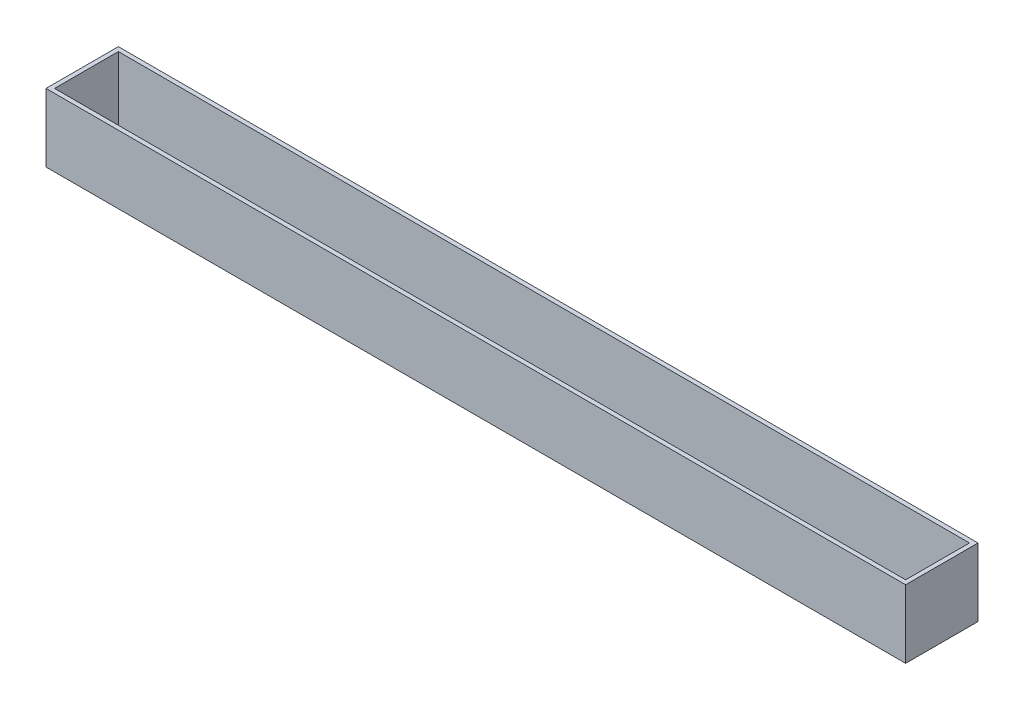
ISO-10303-21;
HEADER;
FILE_DESCRIPTION(('STEP AP214'),'2;1');
FILE_NAME('part.step','',(''),(''),'','','');
FILE_SCHEMA(('AUTOMOTIVE_DESIGN { 1 0 10303 214 1 1 1 1 }'));
ENDSEC;
DATA;
#1=APPLICATION_CONTEXT('core data for automotive mechanical design processes');
#2=APPLICATION_PROTOCOL_DEFINITION('international standard','automotive_design',2000,#1);
#3=PRODUCT_CONTEXT('',#1,'mechanical');
#4=PRODUCT('Part','Part','',(#3));
#5=PRODUCT_RELATED_PRODUCT_CATEGORY('part','',(#4));
#6=PRODUCT_DEFINITION_FORMATION('','',#4);
#7=PRODUCT_DEFINITION_CONTEXT('part definition',#1,'design');
#8=PRODUCT_DEFINITION('design','',#6,#7);
#9=PRODUCT_DEFINITION_SHAPE('','',#8);
#10=(LENGTH_UNIT() NAMED_UNIT(*) SI_UNIT(.MILLI.,.METRE.));
#11=(NAMED_UNIT(*) PLANE_ANGLE_UNIT() SI_UNIT($,.RADIAN.));
#12=(NAMED_UNIT(*) SI_UNIT($,.STERADIAN.) SOLID_ANGLE_UNIT());
#13=UNCERTAINTY_MEASURE_WITH_UNIT(LENGTH_MEASURE(1.E-05),#10,'distance_accuracy_value','');
#14=(GEOMETRIC_REPRESENTATION_CONTEXT(3) GLOBAL_UNCERTAINTY_ASSIGNED_CONTEXT((#13)) GLOBAL_UNIT_ASSIGNED_CONTEXT((#10,
#11,#12)) REPRESENTATION_CONTEXT('',''));
#15=CARTESIAN_POINT('',(0.,0.,0.));
#16=DIRECTION('',(0.,0.,1.));
#17=DIRECTION('',(1.,0.,0.));
#18=AXIS2_PLACEMENT_3D('',#15,#16,#17);
#19=CARTESIAN_POINT('',(-62.8042220957826,32.,-34.));
#20=DIRECTION('',(1.,0.,0.));
#21=DIRECTION('',(0.,0.,-1.));
#22=AXIS2_PLACEMENT_3D('',#19,#20,#21);
#23=PLANE('',#22);
#24=DIRECTION('',(0.,0.,1.));
#25=VECTOR('',#24,1.);
#26=CARTESIAN_POINT('',(-62.8042220957826,0.,-34.));
#27=LINE('',#26,#25);
#28=CARTESIAN_POINT('',(-62.8042220957826,0.,-34.));
#29=VERTEX_POINT('',#28);
#30=CARTESIAN_POINT('',(-62.8042220957826,0.,0.));
#31=VERTEX_POINT('',#30);
#32=EDGE_CURVE('E140',#29,#31,#27,.T.);
#33=ORIENTED_EDGE('',*,*,#32,.T.);
#34=DIRECTION('',(0.,-1.,0.));
#35=VECTOR('',#34,1.);
#36=CARTESIAN_POINT('',(-62.8042220957826,32.,0.));
#37=LINE('',#36,#35);
#38=CARTESIAN_POINT('',(-62.8042220957826,32.,0.));
#39=VERTEX_POINT('',#38);
#40=EDGE_CURVE('E11',#39,#31,#37,.T.);
#41=ORIENTED_EDGE('',*,*,#40,.F.);
#42=DIRECTION('',(0.,0.,1.));
#43=VECTOR('',#42,1.);
#44=CARTESIAN_POINT('',(-62.8042220957826,32.,-34.));
#45=LINE('',#44,#43);
#46=CARTESIAN_POINT('',(-62.8042220957826,32.,-34.));
#47=VERTEX_POINT('',#46);
#48=EDGE_CURVE('E144',#47,#39,#45,.T.);
#49=ORIENTED_EDGE('',*,*,#48,.F.);
#50=DIRECTION('',(0.,-1.,0.));
#51=VECTOR('',#50,1.);
#52=CARTESIAN_POINT('',(-62.8042220957826,32.,-34.));
#53=LINE('',#52,#51);
#54=EDGE_CURVE('E150',#47,#29,#53,.T.);
#55=ORIENTED_EDGE('',*,*,#54,.T.);
#56=EDGE_LOOP('',(#33,#41,#49,#55));
#57=FACE_BOUND('',#56,.T.);
#58=ADVANCED_FACE('F32',(#57),#23,.F.);
#59=CARTESIAN_POINT('',(-62.8042220957826,32.,0.));
#60=DIRECTION('',(0.,0.,-1.));
#61=DIRECTION('',(-1.,0.,0.));
#62=AXIS2_PLACEMENT_3D('',#59,#60,#61);
#63=PLANE('',#62);
#64=DIRECTION('',(1.,0.,0.));
#65=VECTOR('',#64,1.);
#66=CARTESIAN_POINT('',(-62.8042220957826,0.,0.));
#67=LINE('',#66,#65);
#68=CARTESIAN_POINT('',(341.195777904217,0.,0.));
#69=VERTEX_POINT('',#68);
#70=EDGE_CURVE('E153',#31,#69,#67,.T.);
#71=ORIENTED_EDGE('',*,*,#70,.T.);
#72=DIRECTION('',(0.,-1.,0.));
#73=VECTOR('',#72,1.);
#74=CARTESIAN_POINT('',(341.195777904217,32.,0.));
#75=LINE('',#74,#73);
#76=CARTESIAN_POINT('',(341.195777904217,32.,0.));
#77=VERTEX_POINT('',#76);
#78=EDGE_CURVE('E39',#77,#69,#75,.T.);
#79=ORIENTED_EDGE('',*,*,#78,.F.);
#80=DIRECTION('',(1.,0.,0.));
#81=VECTOR('',#80,1.);
#82=CARTESIAN_POINT('',(-62.8042220957826,32.,0.));
#83=LINE('',#82,#81);
#84=EDGE_CURVE('E83',#39,#77,#83,.T.);
#85=ORIENTED_EDGE('',*,*,#84,.F.);
#86=ORIENTED_EDGE('',*,*,#40,.T.);
#87=EDGE_LOOP('',(#71,#79,#85,#86));
#88=FACE_BOUND('',#87,.T.);
#89=ADVANCED_FACE('F182',(#88),#63,.F.);
#90=CARTESIAN_POINT('',(341.195777904217,32.,-34.));
#91=DIRECTION('',(-1.,0.,0.));
#92=DIRECTION('',(0.,0.,1.));
#93=AXIS2_PLACEMENT_3D('',#90,#91,#92);
#94=PLANE('',#93);
#95=DIRECTION('',(0.,0.,-1.));
#96=VECTOR('',#95,1.);
#97=CARTESIAN_POINT('',(341.195777904217,0.,-34.));
#98=LINE('',#97,#96);
#99=CARTESIAN_POINT('',(341.195777904217,0.,-34.));
#100=VERTEX_POINT('',#99);
#101=EDGE_CURVE('E155',#69,#100,#98,.T.);
#102=ORIENTED_EDGE('',*,*,#101,.T.);
#103=DIRECTION('',(0.,-1.,0.));
#104=VECTOR('',#103,1.);
#105=CARTESIAN_POINT('',(341.195777904217,32.,-34.));
#106=LINE('',#105,#104);
#107=CARTESIAN_POINT('',(341.195777904217,32.,-34.));
#108=VERTEX_POINT('',#107);
#109=EDGE_CURVE('E159',#108,#100,#106,.T.);
#110=ORIENTED_EDGE('',*,*,#109,.F.);
#111=DIRECTION('',(0.,0.,-1.));
#112=VECTOR('',#111,1.);
#113=CARTESIAN_POINT('',(341.195777904217,32.,-34.));
#114=LINE('',#113,#112);
#115=EDGE_CURVE('E147',#77,#108,#114,.T.);
#116=ORIENTED_EDGE('',*,*,#115,.F.);
#117=ORIENTED_EDGE('',*,*,#78,.T.);
#118=EDGE_LOOP('',(#102,#110,#116,#117));
#119=FACE_BOUND('',#118,.T.);
#120=ADVANCED_FACE('F164',(#119),#94,.F.);
#121=CARTESIAN_POINT('',(-62.8042220957826,32.,-34.));
#122=DIRECTION('',(0.,0.,1.));
#123=DIRECTION('',(1.,0.,0.));
#124=AXIS2_PLACEMENT_3D('',#121,#122,#123);
#125=PLANE('',#124);
#126=DIRECTION('',(-1.,0.,0.));
#127=VECTOR('',#126,1.);
#128=CARTESIAN_POINT('',(-62.8042220957826,0.,-34.));
#129=LINE('',#128,#127);
#130=EDGE_CURVE('E76',#100,#29,#129,.T.);
#131=ORIENTED_EDGE('',*,*,#130,.T.);
#132=ORIENTED_EDGE('',*,*,#54,.F.);
#133=DIRECTION('',(-1.,0.,0.));
#134=VECTOR('',#133,1.);
#135=CARTESIAN_POINT('',(-62.8042220957826,32.,-34.));
#136=LINE('',#135,#134);
#137=EDGE_CURVE('E55',#108,#47,#136,.T.);
#138=ORIENTED_EDGE('',*,*,#137,.F.);
#139=ORIENTED_EDGE('',*,*,#109,.T.);
#140=EDGE_LOOP('',(#131,#132,#138,#139));
#141=FACE_BOUND('',#140,.T.);
#142=ADVANCED_FACE('F172',(#141),#125,.F.);
#143=CARTESIAN_POINT('',(0.,32.,0.));
#144=DIRECTION('',(0.,1.,0.));
#145=DIRECTION('',(0.,0.,1.));
#146=AXIS2_PLACEMENT_3D('',#143,#144,#145);
#147=PLANE('',#146);
#148=DIRECTION('',(0.,0.,-1.));
#149=VECTOR('',#148,1.);
#150=CARTESIAN_POINT('',(339.195777904217,32.,-32.));
#151=LINE('',#150,#149);
#152=CARTESIAN_POINT('',(339.195777904217,32.,-2.));
#153=VERTEX_POINT('',#152);
#154=CARTESIAN_POINT('',(339.195777904217,32.,-32.));
#155=VERTEX_POINT('',#154);
#156=EDGE_CURVE('E46',#153,#155,#151,.T.);
#157=ORIENTED_EDGE('',*,*,#156,.F.);
#158=DIRECTION('',(1.,0.,0.));
#159=VECTOR('',#158,1.);
#160=CARTESIAN_POINT('',(-60.8042220957826,32.,-2.));
#161=LINE('',#160,#159);
#162=CARTESIAN_POINT('',(-60.8042220957826,32.,-2.));
#163=VERTEX_POINT('',#162);
#164=EDGE_CURVE('E125',#163,#153,#161,.T.);
#165=ORIENTED_EDGE('',*,*,#164,.F.);
#166=DIRECTION('',(0.,0.,1.));
#167=VECTOR('',#166,1.);
#168=CARTESIAN_POINT('',(-60.8042220957826,32.,-32.));
#169=LINE('',#168,#167);
#170=CARTESIAN_POINT('',(-60.8042220957826,32.,-32.));
#171=VERTEX_POINT('',#170);
#172=EDGE_CURVE('E128',#171,#163,#169,.T.);
#173=ORIENTED_EDGE('',*,*,#172,.F.);
#174=DIRECTION('',(-1.,0.,0.));
#175=VECTOR('',#174,1.);
#176=CARTESIAN_POINT('',(-60.8042220957826,32.,-32.));
#177=LINE('',#176,#175);
#178=EDGE_CURVE('E134',#155,#171,#177,.T.);
#179=ORIENTED_EDGE('',*,*,#178,.F.);
#180=EDGE_LOOP('',(#157,#165,#173,#179));
#181=FACE_BOUND('',#180,.T.);
#182=ORIENTED_EDGE('',*,*,#48,.T.);
#183=ORIENTED_EDGE('',*,*,#84,.T.);
#184=ORIENTED_EDGE('',*,*,#115,.T.);
#185=ORIENTED_EDGE('',*,*,#137,.T.);
#186=EDGE_LOOP('',(#182,#183,#184,#185));
#187=FACE_BOUND('',#186,.T.);
#188=ADVANCED_FACE('F174',(#181,#187),#147,.T.);
#189=CARTESIAN_POINT('',(0.,0.,0.));
#190=DIRECTION('',(0.,1.,0.));
#191=DIRECTION('',(0.,0.,1.));
#192=AXIS2_PLACEMENT_3D('',#189,#190,#191);
#193=PLANE('',#192);
#194=ORIENTED_EDGE('',*,*,#32,.F.);
#195=ORIENTED_EDGE('',*,*,#130,.F.);
#196=ORIENTED_EDGE('',*,*,#101,.F.);
#197=ORIENTED_EDGE('',*,*,#70,.F.);
#198=EDGE_LOOP('',(#194,#195,#196,#197));
#199=FACE_BOUND('',#198,.T.);
#200=ADVANCED_FACE('F168',(#199),#193,.F.);
#201=CARTESIAN_POINT('',(339.195777904217,2.,-32.));
#202=DIRECTION('',(1.,0.,0.));
#203=DIRECTION('',(0.,0.,-1.));
#204=AXIS2_PLACEMENT_3D('',#201,#202,#203);
#205=PLANE('',#204);
#206=ORIENTED_EDGE('',*,*,#156,.T.);
#207=DIRECTION('',(0.,1.,0.));
#208=VECTOR('',#207,1.);
#209=CARTESIAN_POINT('',(339.195777904217,2.,-32.));
#210=LINE('',#209,#208);
#211=CARTESIAN_POINT('',(339.195777904217,2.,-32.));
#212=VERTEX_POINT('',#211);
#213=EDGE_CURVE('E103',#212,#155,#210,.T.);
#214=ORIENTED_EDGE('',*,*,#213,.F.);
#215=DIRECTION('',(0.,0.,-1.));
#216=VECTOR('',#215,1.);
#217=CARTESIAN_POINT('',(339.195777904217,2.,-32.));
#218=LINE('',#217,#216);
#219=CARTESIAN_POINT('',(339.195777904217,2.,-2.));
#220=VERTEX_POINT('',#219);
#221=EDGE_CURVE('E107',#220,#212,#218,.T.);
#222=ORIENTED_EDGE('',*,*,#221,.F.);
#223=DIRECTION('',(0.,1.,0.));
#224=VECTOR('',#223,1.);
#225=CARTESIAN_POINT('',(339.195777904217,2.,-2.));
#226=LINE('',#225,#224);
#227=EDGE_CURVE('E138',#220,#153,#226,.T.);
#228=ORIENTED_EDGE('',*,*,#227,.T.);
#229=EDGE_LOOP('',(#206,#214,#222,#228));
#230=FACE_BOUND('',#229,.T.);
#231=ADVANCED_FACE('F105',(#230),#205,.F.);
#232=CARTESIAN_POINT('',(-60.8042220957826,2.,-2.));
#233=DIRECTION('',(0.,0.,1.));
#234=DIRECTION('',(1.,0.,0.));
#235=AXIS2_PLACEMENT_3D('',#232,#233,#234);
#236=PLANE('',#235);
#237=ORIENTED_EDGE('',*,*,#164,.T.);
#238=ORIENTED_EDGE('',*,*,#227,.F.);
#239=DIRECTION('',(1.,0.,0.));
#240=VECTOR('',#239,1.);
#241=CARTESIAN_POINT('',(-60.8042220957826,2.,-2.));
#242=LINE('',#241,#240);
#243=CARTESIAN_POINT('',(-60.8042220957826,2.,-2.));
#244=VERTEX_POINT('',#243);
#245=EDGE_CURVE('E113',#244,#220,#242,.T.);
#246=ORIENTED_EDGE('',*,*,#245,.F.);
#247=DIRECTION('',(0.,1.,0.));
#248=VECTOR('',#247,1.);
#249=CARTESIAN_POINT('',(-60.8042220957826,2.,-2.));
#250=LINE('',#249,#248);
#251=EDGE_CURVE('E141',#244,#163,#250,.T.);
#252=ORIENTED_EDGE('',*,*,#251,.T.);
#253=EDGE_LOOP('',(#237,#238,#246,#252));
#254=FACE_BOUND('',#253,.T.);
#255=ADVANCED_FACE('F221',(#254),#236,.F.);
#256=CARTESIAN_POINT('',(-60.8042220957826,2.,-32.));
#257=DIRECTION('',(-1.,0.,0.));
#258=DIRECTION('',(0.,0.,1.));
#259=AXIS2_PLACEMENT_3D('',#256,#257,#258);
#260=PLANE('',#259);
#261=ORIENTED_EDGE('',*,*,#172,.T.);
#262=ORIENTED_EDGE('',*,*,#251,.F.);
#263=DIRECTION('',(0.,0.,1.));
#264=VECTOR('',#263,1.);
#265=CARTESIAN_POINT('',(-60.8042220957826,2.,-32.));
#266=LINE('',#265,#264);
#267=CARTESIAN_POINT('',(-60.8042220957826,2.,-32.));
#268=VERTEX_POINT('',#267);
#269=EDGE_CURVE('E121',#268,#244,#266,.T.);
#270=ORIENTED_EDGE('',*,*,#269,.F.);
#271=DIRECTION('',(0.,1.,0.));
#272=VECTOR('',#271,1.);
#273=CARTESIAN_POINT('',(-60.8042220957826,2.,-32.));
#274=LINE('',#273,#272);
#275=EDGE_CURVE('E112',#268,#171,#274,.T.);
#276=ORIENTED_EDGE('',*,*,#275,.T.);
#277=EDGE_LOOP('',(#261,#262,#270,#276));
#278=FACE_BOUND('',#277,.T.);
#279=ADVANCED_FACE('F230',(#278),#260,.F.);
#280=CARTESIAN_POINT('',(-60.8042220957826,2.,-32.));
#281=DIRECTION('',(0.,0.,-1.));
#282=DIRECTION('',(-1.,0.,0.));
#283=AXIS2_PLACEMENT_3D('',#280,#281,#282);
#284=PLANE('',#283);
#285=ORIENTED_EDGE('',*,*,#178,.T.);
#286=ORIENTED_EDGE('',*,*,#275,.F.);
#287=DIRECTION('',(-1.,0.,0.));
#288=VECTOR('',#287,1.);
#289=CARTESIAN_POINT('',(-60.8042220957826,2.,-32.));
#290=LINE('',#289,#288);
#291=EDGE_CURVE('E116',#212,#268,#290,.T.);
#292=ORIENTED_EDGE('',*,*,#291,.F.);
#293=ORIENTED_EDGE('',*,*,#213,.T.);
#294=EDGE_LOOP('',(#285,#286,#292,#293));
#295=FACE_BOUND('',#294,.T.);
#296=ADVANCED_FACE('F117',(#295),#284,.F.);
#297=CARTESIAN_POINT('',(0.,2.,0.));
#298=DIRECTION('',(0.,1.,0.));
#299=DIRECTION('',(0.,0.,1.));
#300=AXIS2_PLACEMENT_3D('',#297,#298,#299);
#301=PLANE('',#300);
#302=ORIENTED_EDGE('',*,*,#221,.T.);
#303=ORIENTED_EDGE('',*,*,#291,.T.);
#304=ORIENTED_EDGE('',*,*,#269,.T.);
#305=ORIENTED_EDGE('',*,*,#245,.T.);
#306=EDGE_LOOP('',(#302,#303,#304,#305));
#307=FACE_BOUND('',#306,.T.);
#308=ADVANCED_FACE('F123',(#307),#301,.T.);
#309=CLOSED_SHELL('',(#58,#89,#120,#142,#188,#200,#231,#255,#279,#296,#308));
#310=MANIFOLD_SOLID_BREP('B2',#309);
#311=ADVANCED_BREP_SHAPE_REPRESENTATION('',(#18,#310),#14);
#312=SHAPE_DEFINITION_REPRESENTATION(#9,#311);
ENDSEC;
END-ISO-10303-21;
